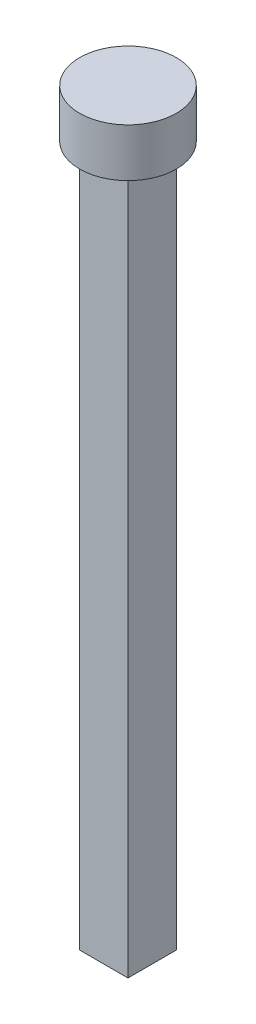
ISO-10303-21;
HEADER;
FILE_DESCRIPTION(('STEP AP214'),'2;1');
FILE_NAME('part.step','',(''),(''),'','','');
FILE_SCHEMA(('AUTOMOTIVE_DESIGN { 1 0 10303 214 1 1 1 1 }'));
ENDSEC;
DATA;
#1=APPLICATION_CONTEXT('core data for automotive mechanical design processes');
#2=APPLICATION_PROTOCOL_DEFINITION('international standard','automotive_design',2000,#1);
#3=PRODUCT_CONTEXT('',#1,'mechanical');
#4=PRODUCT('Part','Part','',(#3));
#5=PRODUCT_RELATED_PRODUCT_CATEGORY('part','',(#4));
#6=PRODUCT_DEFINITION_FORMATION('','',#4);
#7=PRODUCT_DEFINITION_CONTEXT('part definition',#1,'design');
#8=PRODUCT_DEFINITION('design','',#6,#7);
#9=PRODUCT_DEFINITION_SHAPE('','',#8);
#10=(LENGTH_UNIT() NAMED_UNIT(*) SI_UNIT(.MILLI.,.METRE.));
#11=(NAMED_UNIT(*) PLANE_ANGLE_UNIT() SI_UNIT($,.RADIAN.));
#12=(NAMED_UNIT(*) SI_UNIT($,.STERADIAN.) SOLID_ANGLE_UNIT());
#13=UNCERTAINTY_MEASURE_WITH_UNIT(LENGTH_MEASURE(1.E-05),#10,'distance_accuracy_value','');
#14=(GEOMETRIC_REPRESENTATION_CONTEXT(3) GLOBAL_UNCERTAINTY_ASSIGNED_CONTEXT((#13)) GLOBAL_UNIT_ASSIGNED_CONTEXT((#10,
#11,#12)) REPRESENTATION_CONTEXT('',''));
#15=CARTESIAN_POINT('',(0.,0.,0.));
#16=DIRECTION('',(0.,0.,1.));
#17=DIRECTION('',(1.,0.,0.));
#18=AXIS2_PLACEMENT_3D('',#15,#16,#17);
#19=CARTESIAN_POINT('',(0.,0.,0.));
#20=DIRECTION('',(0.,1.,0.));
#21=DIRECTION('',(0.,0.,1.));
#22=AXIS2_PLACEMENT_3D('',#19,#20,#21);
#23=PLANE('',#22);
#24=CARTESIAN_POINT('',(0.,0.,0.));
#25=DIRECTION('',(0.,1.,0.));
#26=DIRECTION('',(0.,0.,1.));
#27=AXIS2_PLACEMENT_3D('',#24,#25,#26);
#28=CIRCLE('',#27,20.);
#29=CARTESIAN_POINT('',(0.,0.,20.));
#30=VERTEX_POINT('',#29);
#31=EDGE_CURVE('E36',#30,#30,#28,.T.);
#32=ORIENTED_EDGE('',*,*,#31,.F.);
#33=EDGE_LOOP('',(#32));
#34=FACE_BOUND('',#33,.T.);
#35=DIRECTION('',(0.,0.,-1.));
#36=VECTOR('',#35,1.);
#37=CARTESIAN_POINT('',(-10.,0.,-10.));
#38=LINE('',#37,#36);
#39=CARTESIAN_POINT('',(-10.,0.,10.));
#40=VERTEX_POINT('',#39);
#41=CARTESIAN_POINT('',(-10.,0.,-10.));
#42=VERTEX_POINT('',#41);
#43=EDGE_CURVE('E93',#40,#42,#38,.T.);
#44=ORIENTED_EDGE('',*,*,#43,.F.);
#45=DIRECTION('',(-1.,0.,0.));
#46=VECTOR('',#45,1.);
#47=CARTESIAN_POINT('',(10.,0.,10.));
#48=LINE('',#47,#46);
#49=CARTESIAN_POINT('',(10.,0.,10.));
#50=VERTEX_POINT('',#49);
#51=EDGE_CURVE('E90',#50,#40,#48,.T.);
#52=ORIENTED_EDGE('',*,*,#51,.F.);
#53=DIRECTION('',(0.,0.,1.));
#54=VECTOR('',#53,1.);
#55=CARTESIAN_POINT('',(10.,0.,-10.));
#56=LINE('',#55,#54);
#57=CARTESIAN_POINT('',(10.,0.,-10.));
#58=VERTEX_POINT('',#57);
#59=EDGE_CURVE('E52',#58,#50,#56,.T.);
#60=ORIENTED_EDGE('',*,*,#59,.F.);
#61=DIRECTION('',(1.,0.,0.));
#62=VECTOR('',#61,1.);
#63=CARTESIAN_POINT('',(10.,0.,-10.));
#64=LINE('',#63,#62);
#65=EDGE_CURVE('E47',#42,#58,#64,.T.);
#66=ORIENTED_EDGE('',*,*,#65,.F.);
#67=EDGE_LOOP('',(#44,#52,#60,#66));
#68=FACE_BOUND('',#67,.T.);
#69=ADVANCED_FACE('F32',(#34,#68),#23,.F.);
#70=CARTESIAN_POINT('',(0.,20.,0.));
#71=DIRECTION('',(0.,-1.,0.));
#72=DIRECTION('',(0.,0.,-1.));
#73=AXIS2_PLACEMENT_3D('',#70,#71,#72);
#74=CYLINDRICAL_SURFACE('',#73,20.);
#75=CARTESIAN_POINT('',(0.,20.,0.));
#76=DIRECTION('',(0.,1.,0.));
#77=DIRECTION('',(0.,0.,1.));
#78=AXIS2_PLACEMENT_3D('',#75,#76,#77);
#79=CIRCLE('',#78,20.);
#80=CARTESIAN_POINT('',(0.,20.,20.));
#81=VERTEX_POINT('',#80);
#82=EDGE_CURVE('E11',#81,#81,#79,.T.);
#83=ORIENTED_EDGE('',*,*,#82,.F.);
#84=EDGE_LOOP('',(#83));
#85=FACE_BOUND('',#84,.T.);
#86=ORIENTED_EDGE('',*,*,#31,.T.);
#87=EDGE_LOOP('',(#86));
#88=FACE_BOUND('',#87,.T.);
#89=ADVANCED_FACE('F34',(#85,#88),#74,.T.);
#90=CARTESIAN_POINT('',(0.,20.,0.));
#91=DIRECTION('',(0.,1.,0.));
#92=DIRECTION('',(0.,0.,1.));
#93=AXIS2_PLACEMENT_3D('',#90,#91,#92);
#94=PLANE('',#93);
#95=ORIENTED_EDGE('',*,*,#82,.T.);
#96=EDGE_LOOP('',(#95));
#97=FACE_BOUND('',#96,.T.);
#98=ADVANCED_FACE('F139',(#97),#94,.T.);
#99=CARTESIAN_POINT('',(-10.,-290.,-10.));
#100=DIRECTION('',(1.,0.,0.));
#101=DIRECTION('',(0.,0.,-1.));
#102=AXIS2_PLACEMENT_3D('',#99,#100,#101);
#103=PLANE('',#102);
#104=ORIENTED_EDGE('',*,*,#43,.T.);
#105=DIRECTION('',(0.,1.,0.));
#106=VECTOR('',#105,1.);
#107=CARTESIAN_POINT('',(-10.,-290.,-10.));
#108=LINE('',#107,#106);
#109=CARTESIAN_POINT('',(-10.,-290.,-10.));
#110=VERTEX_POINT('',#109);
#111=EDGE_CURVE('E74',#110,#42,#108,.T.);
#112=ORIENTED_EDGE('',*,*,#111,.F.);
#113=DIRECTION('',(0.,0.,-1.));
#114=VECTOR('',#113,1.);
#115=CARTESIAN_POINT('',(-10.,-290.,-10.));
#116=LINE('',#115,#114);
#117=CARTESIAN_POINT('',(-10.,-290.,10.));
#118=VERTEX_POINT('',#117);
#119=EDGE_CURVE('E81',#118,#110,#116,.T.);
#120=ORIENTED_EDGE('',*,*,#119,.F.);
#121=DIRECTION('',(0.,1.,0.));
#122=VECTOR('',#121,1.);
#123=CARTESIAN_POINT('',(-10.,-290.,10.));
#124=LINE('',#123,#122);
#125=EDGE_CURVE('E101',#118,#40,#124,.T.);
#126=ORIENTED_EDGE('',*,*,#125,.T.);
#127=EDGE_LOOP('',(#104,#112,#120,#126));
#128=FACE_BOUND('',#127,.T.);
#129=ADVANCED_FACE('F92',(#128),#103,.F.);
#130=CARTESIAN_POINT('',(10.,-290.,-10.));
#131=DIRECTION('',(0.,0.,1.));
#132=DIRECTION('',(1.,0.,0.));
#133=AXIS2_PLACEMENT_3D('',#130,#131,#132);
#134=PLANE('',#133);
#135=ORIENTED_EDGE('',*,*,#65,.T.);
#136=DIRECTION('',(0.,1.,0.));
#137=VECTOR('',#136,1.);
#138=CARTESIAN_POINT('',(10.,-290.,-10.));
#139=LINE('',#138,#137);
#140=CARTESIAN_POINT('',(10.,-290.,-10.));
#141=VERTEX_POINT('',#140);
#142=EDGE_CURVE('E77',#141,#58,#139,.T.);
#143=ORIENTED_EDGE('',*,*,#142,.F.);
#144=DIRECTION('',(1.,0.,0.));
#145=VECTOR('',#144,1.);
#146=CARTESIAN_POINT('',(10.,-290.,-10.));
#147=LINE('',#146,#145);
#148=EDGE_CURVE('E70',#110,#141,#147,.T.);
#149=ORIENTED_EDGE('',*,*,#148,.F.);
#150=ORIENTED_EDGE('',*,*,#111,.T.);
#151=EDGE_LOOP('',(#135,#143,#149,#150));
#152=FACE_BOUND('',#151,.T.);
#153=ADVANCED_FACE('F72',(#152),#134,.F.);
#154=CARTESIAN_POINT('',(10.,-290.,-10.));
#155=DIRECTION('',(-1.,0.,0.));
#156=DIRECTION('',(0.,0.,1.));
#157=AXIS2_PLACEMENT_3D('',#154,#155,#156);
#158=PLANE('',#157);
#159=ORIENTED_EDGE('',*,*,#59,.T.);
#160=DIRECTION('',(0.,1.,0.));
#161=VECTOR('',#160,1.);
#162=CARTESIAN_POINT('',(10.,-290.,10.));
#163=LINE('',#162,#161);
#164=CARTESIAN_POINT('',(10.,-290.,10.));
#165=VERTEX_POINT('',#164);
#166=EDGE_CURVE('E96',#165,#50,#163,.T.);
#167=ORIENTED_EDGE('',*,*,#166,.F.);
#168=DIRECTION('',(0.,0.,1.));
#169=VECTOR('',#168,1.);
#170=CARTESIAN_POINT('',(10.,-290.,-10.));
#171=LINE('',#170,#169);
#172=EDGE_CURVE('E80',#141,#165,#171,.T.);
#173=ORIENTED_EDGE('',*,*,#172,.F.);
#174=ORIENTED_EDGE('',*,*,#142,.T.);
#175=EDGE_LOOP('',(#159,#167,#173,#174));
#176=FACE_BOUND('',#175,.T.);
#177=ADVANCED_FACE('F131',(#176),#158,.F.);
#178=CARTESIAN_POINT('',(10.,-290.,10.));
#179=DIRECTION('',(0.,0.,-1.));
#180=DIRECTION('',(-1.,0.,0.));
#181=AXIS2_PLACEMENT_3D('',#178,#179,#180);
#182=PLANE('',#181);
#183=ORIENTED_EDGE('',*,*,#51,.T.);
#184=ORIENTED_EDGE('',*,*,#125,.F.);
#185=DIRECTION('',(-1.,0.,0.));
#186=VECTOR('',#185,1.);
#187=CARTESIAN_POINT('',(10.,-290.,10.));
#188=LINE('',#187,#186);
#189=EDGE_CURVE('E86',#165,#118,#188,.T.);
#190=ORIENTED_EDGE('',*,*,#189,.F.);
#191=ORIENTED_EDGE('',*,*,#166,.T.);
#192=EDGE_LOOP('',(#183,#184,#190,#191));
#193=FACE_BOUND('',#192,.T.);
#194=ADVANCED_FACE('F126',(#193),#182,.F.);
#195=CARTESIAN_POINT('',(-10.,-290.,10.));
#196=DIRECTION('',(0.,-1.,0.));
#197=DIRECTION('',(0.,0.,-1.));
#198=AXIS2_PLACEMENT_3D('',#195,#196,#197);
#199=PLANE('',#198);
#200=CARTESIAN_POINT('',(0.,-290.,0.));
#201=DIRECTION('',(0.,-1.,0.));
#202=DIRECTION('',(0.,0.,-1.));
#203=AXIS2_PLACEMENT_3D('',#200,#201,#202);
#204=CIRCLE('',#203,5.);
#205=CARTESIAN_POINT('',(0.,-290.,-5.));
#206=VERTEX_POINT('',#205);
#207=EDGE_CURVE('E111',#206,#206,#204,.T.);
#208=ORIENTED_EDGE('',*,*,#207,.F.);
#209=EDGE_LOOP('',(#208));
#210=FACE_BOUND('',#209,.T.);
#211=ORIENTED_EDGE('',*,*,#119,.T.);
#212=ORIENTED_EDGE('',*,*,#148,.T.);
#213=ORIENTED_EDGE('',*,*,#172,.T.);
#214=ORIENTED_EDGE('',*,*,#189,.T.);
#215=EDGE_LOOP('',(#211,#212,#213,#214));
#216=FACE_BOUND('',#215,.T.);
#217=ADVANCED_FACE('F84',(#210,#216),#199,.T.);
#218=CARTESIAN_POINT('',(0.,-280.,0.));
#219=DIRECTION('',(0.,-1.,0.));
#220=DIRECTION('',(0.,0.,-1.));
#221=AXIS2_PLACEMENT_3D('',#218,#219,#220);
#222=CYLINDRICAL_SURFACE('',#221,5.);
#223=CARTESIAN_POINT('',(0.,-280.,0.));
#224=DIRECTION('',(0.,-1.,0.));
#225=DIRECTION('',(0.,0.,-1.));
#226=AXIS2_PLACEMENT_3D('',#223,#224,#225);
#227=CIRCLE('',#226,5.);
#228=CARTESIAN_POINT('',(0.,-280.,-5.));
#229=VERTEX_POINT('',#228);
#230=EDGE_CURVE('E108',#229,#229,#227,.T.);
#231=ORIENTED_EDGE('',*,*,#230,.F.);
#232=EDGE_LOOP('',(#231));
#233=FACE_BOUND('',#232,.T.);
#234=ORIENTED_EDGE('',*,*,#207,.T.);
#235=EDGE_LOOP('',(#234));
#236=FACE_BOUND('',#235,.T.);
#237=ADVANCED_FACE('F119',(#233,#236),#222,.F.);
#238=CARTESIAN_POINT('',(0.,-280.,0.));
#239=DIRECTION('',(0.,-1.,0.));
#240=DIRECTION('',(0.,0.,-1.));
#241=AXIS2_PLACEMENT_3D('',#238,#239,#240);
#242=PLANE('',#241);
#243=ORIENTED_EDGE('',*,*,#230,.T.);
#244=EDGE_LOOP('',(#243));
#245=FACE_BOUND('',#244,.T.);
#246=ADVANCED_FACE('F117',(#245),#242,.T.);
#247=CLOSED_SHELL('',(#69,#89,#98,#129,#153,#177,#194,#217,#237,#246));
#248=MANIFOLD_SOLID_BREP('B2',#247);
#249=ADVANCED_BREP_SHAPE_REPRESENTATION('',(#18,#248),#14);
#250=SHAPE_DEFINITION_REPRESENTATION(#9,#249);
ENDSEC;
END-ISO-10303-21;
